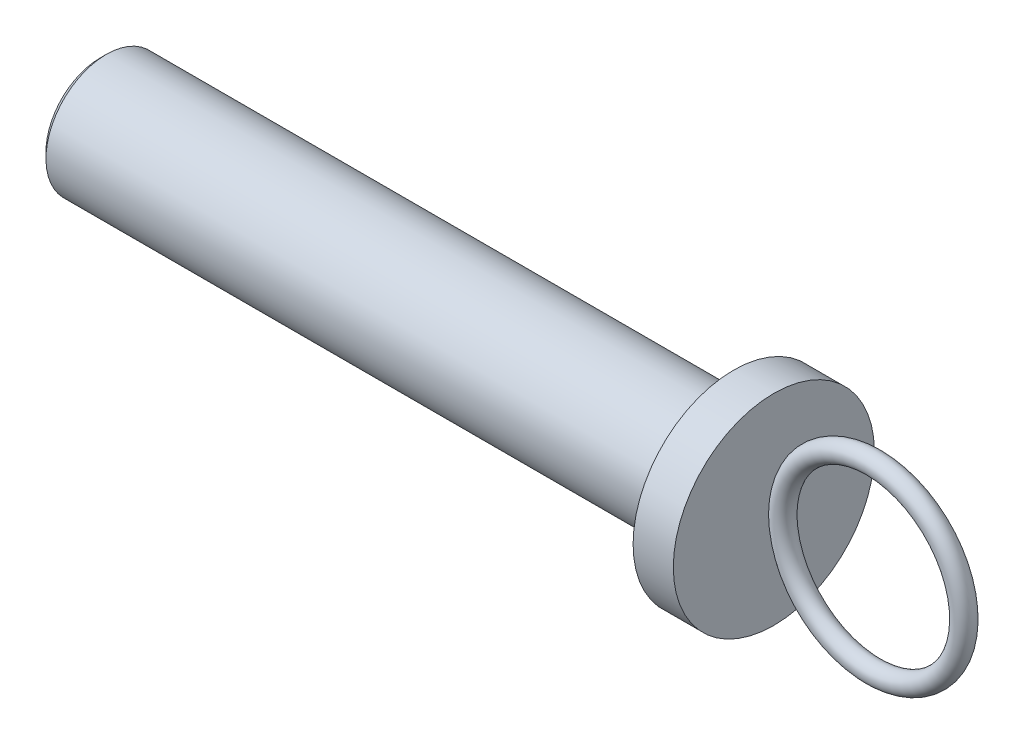
ISO-10303-21;
HEADER;
FILE_DESCRIPTION(('STEP AP214'),'2;1');
FILE_NAME('part.step','',(''),(''),'','','');
FILE_SCHEMA(('AUTOMOTIVE_DESIGN { 1 0 10303 214 1 1 1 1 }'));
ENDSEC;
DATA;
#1=APPLICATION_CONTEXT('core data for automotive mechanical design processes');
#2=APPLICATION_PROTOCOL_DEFINITION('international standard','automotive_design',2000,#1);
#3=PRODUCT_CONTEXT('',#1,'mechanical');
#4=PRODUCT('Part','Part','',(#3));
#5=PRODUCT_RELATED_PRODUCT_CATEGORY('part','',(#4));
#6=PRODUCT_DEFINITION_FORMATION('','',#4);
#7=PRODUCT_DEFINITION_CONTEXT('part definition',#1,'design');
#8=PRODUCT_DEFINITION('design','',#6,#7);
#9=PRODUCT_DEFINITION_SHAPE('','',#8);
#10=(LENGTH_UNIT() NAMED_UNIT(*) SI_UNIT(.MILLI.,.METRE.));
#11=(NAMED_UNIT(*) PLANE_ANGLE_UNIT() SI_UNIT($,.RADIAN.));
#12=(NAMED_UNIT(*) SI_UNIT($,.STERADIAN.) SOLID_ANGLE_UNIT());
#13=UNCERTAINTY_MEASURE_WITH_UNIT(LENGTH_MEASURE(1.E-05),#10,'distance_accuracy_value','');
#14=(GEOMETRIC_REPRESENTATION_CONTEXT(3) GLOBAL_UNCERTAINTY_ASSIGNED_CONTEXT((#13)) GLOBAL_UNIT_ASSIGNED_CONTEXT((#10,
#11,#12)) REPRESENTATION_CONTEXT('',''));
#15=CARTESIAN_POINT('',(0.,0.,0.));
#16=DIRECTION('',(0.,0.,1.));
#17=DIRECTION('',(1.,0.,0.));
#18=AXIS2_PLACEMENT_3D('',#15,#16,#17);
#19=CARTESIAN_POINT('',(0.,0.,0.));
#20=DIRECTION('',(1.,0.,0.));
#21=DIRECTION('',(0.,1.,0.));
#22=AXIS2_PLACEMENT_3D('',#19,#20,#21);
#23=PLANE('',#22);
#24=CARTESIAN_POINT('',(0.,0.,0.));
#25=DIRECTION('',(1.,0.,0.));
#26=DIRECTION('',(0.,1.,0.));
#27=AXIS2_PLACEMENT_3D('',#24,#25,#26);
#28=CIRCLE('',#27,50.);
#29=CARTESIAN_POINT('',(0.,50.,0.));
#30=VERTEX_POINT('',#29);
#31=EDGE_CURVE('E10',#30,#30,#28,.T.);
#32=ORIENTED_EDGE('',*,*,#31,.T.);
#33=EDGE_LOOP('',(#32));
#34=FACE_BOUND('',#33,.T.);
#35=CARTESIAN_POINT('',(0.,0.,2.17944947177033));
#36=CARTESIAN_POINT('',(0.,0.42149878183856,2.17945998659477));
#37=CARTESIAN_POINT('',(0.,0.843027722689126,2.16841904708334));
#38=CARTESIAN_POINT('',(0.,1.68536396219885,2.12318815262287));
#39=CARTESIAN_POINT('',(0.,2.10617001058888,2.08897350495459));
#40=CARTESIAN_POINT('',(0.,2.73471753888769,2.01732833882473));
#41=CARTESIAN_POINT('',(0.,2.94363657789298,1.99008700078861));
#42=CARTESIAN_POINT('',(0.,3.36031705389396,1.92791519862246));
#43=CARTESIAN_POINT('',(0.,3.56807865726714,1.89298587047071));
#44=CARTESIAN_POINT('',(0.,3.9815491142398,1.81421682686651));
#45=CARTESIAN_POINT('',(0.,4.18726089346198,1.77039260504047));
#46=CARTESIAN_POINT('',(0.,4.59603124982678,1.67187975849132));
#47=CARTESIAN_POINT('',(0.,4.79909112998843,1.61719670115698));
#48=CARTESIAN_POINT('',(0.,5.11320466515671,1.52074350807588));
#49=CARTESIAN_POINT('',(0.,5.22572640550955,1.48375706519663));
#50=CARTESIAN_POINT('',(0.,5.44895853441453,1.40443549967379));
#51=CARTESIAN_POINT('',(0.,5.55966794843453,1.36209759965095));
#52=CARTESIAN_POINT('',(0.,5.77845963931046,1.27089103021431));
#53=CARTESIAN_POINT('',(0.,5.8865405251225,1.22201898808466));
#54=CARTESIAN_POINT('',(0.,6.09854862533586,1.11606179693367));
#55=CARTESIAN_POINT('',(0.,6.20248043772922,1.05898608133228));
#56=CARTESIAN_POINT('',(0.,6.40481313003735,0.933359937281019));
#57=CARTESIAN_POINT('',(0.,6.50314189395607,0.864691897900993));
#58=CARTESIAN_POINT('',(0.,6.68726313431992,0.712402419432671));
#59=CARTESIAN_POINT('',(0.,6.77314883497989,0.628903871459761));
#60=CARTESIAN_POINT('',(0.,6.8757787162716,0.498268042379382));
#61=CARTESIAN_POINT('',(0.,6.90303278061325,0.45947898442415));
#62=CARTESIAN_POINT('',(0.,6.95214613324469,0.378547324332877));
#63=CARTESIAN_POINT('',(0.,6.97400491584688,0.336404408336449));
#64=CARTESIAN_POINT('',(0.,7.01083808281939,0.24853394838752));
#65=CARTESIAN_POINT('',(0.,7.0257268979002,0.202769523901598));
#66=CARTESIAN_POINT('',(0.,7.04645295226523,0.109246754611275));
#67=CARTESIAN_POINT('',(0.,7.05230659797149,0.061492185979087));
#68=CARTESIAN_POINT('',(0.,7.05406930243933,-0.0292543239346663));
#69=CARTESIAN_POINT('',(0.,7.0509420613236,-0.072229309776161));
#70=CARTESIAN_POINT('',(0.,7.03716162438825,-0.15695895660505));
#71=CARTESIAN_POINT('',(0.,7.02650140314884,-0.198712440508724));
#72=CARTESIAN_POINT('',(0.,6.99535927964785,-0.289871458175785));
#73=CARTESIAN_POINT('',(0.,6.97311887355608,-0.338667362862952));
#74=CARTESIAN_POINT('',(0.,6.92117709628851,-0.432083951970965));
#75=CARTESIAN_POINT('',(0.,6.89146055486769,-0.476695890687562));
#76=CARTESIAN_POINT('',(0.,6.80485532696441,-0.590572331510381));
#77=CARTESIAN_POINT('',(0.,6.74316841758978,-0.656141724988561));
#78=CARTESIAN_POINT('',(0.,6.61121393622031,-0.777885124418113));
#79=CARTESIAN_POINT('',(0.,6.54092138014418,-0.834030595690454));
#80=CARTESIAN_POINT('',(0.,6.36868536131937,-0.957917873318232));
#81=CARTESIAN_POINT('',(0.,6.26449637346105,-1.02249899099252));
#82=CARTESIAN_POINT('',(0.,6.0504723175763,-1.14166535105351));
#83=CARTESIAN_POINT('',(0.,5.94062622347301,-1.1962300476875));
#84=CARTESIAN_POINT('',(0.,5.71691063613275,-1.29782453209946));
#85=CARTESIAN_POINT('',(0.,5.60302446944741,-1.34481718787084));
#86=CARTESIAN_POINT('',(0.,5.37300224226769,-1.43248201978746));
#87=CARTESIAN_POINT('',(0.,5.25686835672187,-1.47315999292818));
#88=CARTESIAN_POINT('',(0.,4.95344797587697,-1.57200493234357));
#89=CARTESIAN_POINT('',(0.,4.76487364590706,-1.62620743035004));
#90=CARTESIAN_POINT('',(0.,4.38507011567415,-1.72448075127132));
#91=CARTESIAN_POINT('',(0.,4.19383962017605,-1.76854643305016));
#92=CARTESIAN_POINT('',(0.,3.80930747760474,-1.84841620213058));
#93=CARTESIAN_POINT('',(0.,3.61600265523733,-1.88420486609413));
#94=CARTESIAN_POINT('',(0.,3.22819781392611,-1.94865007485328));
#95=CARTESIAN_POINT('',(0.,3.03369761839277,-1.97730553860021));
#96=CARTESIAN_POINT('',(0.,2.44780338105798,-2.05406713367449));
#97=CARTESIAN_POINT('',(0.,2.05515848590833,-2.09274358527696));
#98=CARTESIAN_POINT('',(0.,1.26892169615385,-2.14903314060557));
#99=CARTESIAN_POINT('',(0.,0.875331464804734,-2.16667103490342));
#100=CARTESIAN_POINT('',(0.,0.0355100722776041,-2.18359538728171));
#101=CARTESIAN_POINT('',(0.,-0.410777411562641,-2.18013678180801));
#102=CARTESIAN_POINT('',(0.,-1.30304763369249,-2.14800165032402));
#103=CARTESIAN_POINT('',(0.,-1.74902937985356,-2.11929516613826));
#104=CARTESIAN_POINT('',(0.,-2.41467249606519,-2.05469940727802));
#105=CARTESIAN_POINT('',(0.,-2.63541038360809,-2.02967394396318));
#106=CARTESIAN_POINT('',(0.,-3.07581583397932,-1.97158676878631));
#107=CARTESIAN_POINT('',(0.,-3.29548354427478,-1.93852619803324));
#108=CARTESIAN_POINT('',(0.,-3.73286882380672,-1.86316489118027));
#109=CARTESIAN_POINT('',(0.,-3.95058901460545,-1.82087950567084));
#110=CARTESIAN_POINT('',(0.,-4.38352365652223,-1.72513406489578));
#111=CARTESIAN_POINT('',(0.,-4.5987392380628,-1.6716792750586));
#112=CARTESIAN_POINT('',(0.,-4.93242244589615,-1.57680841630995));
#113=CARTESIAN_POINT('',(0.,-5.05227430378716,-1.54026170895099));
#114=CARTESIAN_POINT('',(0.,-5.29025594647154,-1.46169632013567));
#115=CARTESIAN_POINT('',(0.,-5.40838489898437,-1.4196750855039));
#116=CARTESIAN_POINT('',(0.,-5.6422119188477,-1.32894553586474));
#117=CARTESIAN_POINT('',(0.,-5.75790737835958,-1.28023043032896));
#118=CARTESIAN_POINT('',(0.,-5.98535646460333,-1.17442480556571));
#119=CARTESIAN_POINT('',(0.,-6.09711402125455,-1.11734294769992));
#120=CARTESIAN_POINT('',(0.,-6.31534981053315,-0.991578699532659));
#121=CARTESIAN_POINT('',(0.,-6.42176976259173,-0.922794054102972));
#122=CARTESIAN_POINT('',(0.,-6.62277815714594,-0.769906612766153));
#123=CARTESIAN_POINT('',(0.,-6.71744707452865,-0.685918949242545));
#124=CARTESIAN_POINT('',(0.,-6.83259199612223,-0.554244909761135));
#125=CARTESIAN_POINT('',(0.,-6.86319645284333,-0.515510667955197));
#126=CARTESIAN_POINT('',(0.,-6.91932485823459,-0.434421020387249));
#127=CARTESIAN_POINT('',(0.,-6.94484634796394,-0.392063876101051));
#128=CARTESIAN_POINT('',(0.,-6.98928518334076,-0.303256767548711));
#129=CARTESIAN_POINT('',(0.,-7.00811546072234,-0.25676204012301));
#130=CARTESIAN_POINT('',(0.,-7.03658525286622,-0.161053281266286));
#131=CARTESIAN_POINT('',(0.,-7.04624588755985,-0.111845776224539));
#132=CARTESIAN_POINT('',(0.,-7.05458669702452,-0.01728240125677));
#133=CARTESIAN_POINT('',(0.,-7.05423613779896,0.02798715789848));
#134=CARTESIAN_POINT('',(0.,-7.04497970483613,0.117650334713045));
#135=CARTESIAN_POINT('',(0.,-7.03606695035198,0.162043218575106));
#136=CARTESIAN_POINT('',(0.,-7.00913534044537,0.254122307034996));
#137=CARTESIAN_POINT('',(0.,-6.99009808678667,0.301504089437999));
#138=CARTESIAN_POINT('',(0.,-6.94465769341792,0.392567053069191));
#139=CARTESIAN_POINT('',(0.,-6.91824161676512,0.436241557537717));
#140=CARTESIAN_POINT('',(0.,-6.84211815750932,0.545524279312061));
#141=CARTESIAN_POINT('',(0.,-6.7880843221241,0.608080577602883));
#142=CARTESIAN_POINT('',(0.,-6.67163798663171,0.724744813787047));
#143=CARTESIAN_POINT('',(0.,-6.60920237227783,0.778828521263772));
#144=CARTESIAN_POINT('',(0.,-6.45970866169796,0.89530045457902));
#145=CARTESIAN_POINT('',(0.,-6.37085872507568,0.955358435834267));
#146=CARTESIAN_POINT('',(0.,-6.18785193917911,1.06688305517149));
#147=CARTESIAN_POINT('',(0.,-6.09368529018751,1.11833308662321));
#148=CARTESIAN_POINT('',(0.,-5.90148662885084,1.21470068123799));
#149=CARTESIAN_POINT('',(0.,-5.80343695173868,1.25958261175952));
#150=CARTESIAN_POINT('',(0.,-5.60510795366906,1.34378051469834));
#151=CARTESIAN_POINT('',(0.,-5.50483061170207,1.38310121541691));
#152=CARTESIAN_POINT('',(0.,-5.24427436420939,1.47856605905192));
#153=CARTESIAN_POINT('',(0.,-5.0827593113308,1.5313265727075));
#154=CARTESIAN_POINT('',(0.,-4.75708536476196,1.62804561156496));
#155=CARTESIAN_POINT('',(0.,-4.59292514748774,1.67199957243182));
#156=CARTESIAN_POINT('',(0.,-4.26255226726789,1.75275184318911));
#157=CARTESIAN_POINT('',(0.,-4.09633641566277,1.78953699942011));
#158=CARTESIAN_POINT('',(0.,-3.76265354985,1.85695917294306));
#159=CARTESIAN_POINT('',(0.,-3.59518634810483,1.88759524870568));
#160=CARTESIAN_POINT('',(0.,-3.09173815919111,1.97146155174675));
#161=CARTESIAN_POINT('',(0.,-2.75442000828965,2.01671741415881));
#162=CARTESIAN_POINT('',(0.,-2.07833897486486,2.08987891962339));
#163=CARTESIAN_POINT('',(0.,-1.73957793284239,2.11780234154776));
#164=CARTESIAN_POINT('',(0.,-1.167276062117,2.15200686118283));
#165=CARTESIAN_POINT('',(0.,-0.933967456387854,2.16232552057151));
#166=CARTESIAN_POINT('',(0.,-0.467109010978816,2.17604453260486));
#167=CARTESIAN_POINT('',(0.,-0.233559135566106,2.17944364533994));
#168=CARTESIAN_POINT('',(0.,0.,2.17944947177033));
#169=B_SPLINE_CURVE_WITH_KNOTS('',3,(#35,#36,#37,#38,#39,#40,#41,#42,#43,#44,#45,#46,#47,#48,
#49,#50,#51,#52,#53,#54,#55,#56,#57,#58,#59,#60,#61,#62,#63,#64,#65,#66,#67,#68,#69,#70,#71,#72,
#73,#74,#75,#76,#77,#78,#79,#80,#81,#82,#83,#84,#85,#86,#87,#88,#89,#90,#91,#92,#93,#94,#95,#96,
#97,#98,#99,#100,#101,#102,#103,#104,#105,#106,#107,#108,#109,#110,#111,#112,#113,#114,#115,
#116,#117,#118,#119,#120,#121,#122,#123,#124,#125,#126,#127,#128,#129,#130,#131,#132,#133,#134,
#135,#136,#137,#138,#139,#140,#141,#142,#143,#144,#145,#146,#147,#148,#149,#150,#151,#152,#153,
#154,#155,#156,#157,#158,#159,#160,#161,#162,#163,#164,#165,#166,#167,#168),.UNSPECIFIED.,.T.,
.F.,(4,2,2,2,2,2,2,2,2,2,2,2,2,2,2,2,2,2,2,2,2,2,2,2,2,2,2,2,2,2,2,2,2,2,2,2,2,2,2,2,2,2,2,2,2,
2,2,2,2,2,2,2,2,2,2,2,2,2,2,2,2,2,2,2,2,2,4),(0.,1.26441863343538,2.5301866907775,
3.16213858340576,3.79399716136293,4.42476443491072,5.05520914148919,5.41044125196759,
5.76585848899681,6.12145989448238,6.47665561688514,6.83569929330721,7.19189592183801,
7.33378713970543,7.47569165167126,7.61929535633629,7.76263799159498,7.89119158031978,
8.01986521939751,8.1798429188074,8.3401478937655,8.60870050608162,8.8780521467,9.24491867464901,
9.61252951225128,9.98189152543646,10.3509124262644,10.939135055324,11.5276553614474,
12.1172636319069,12.7069612041785,13.8898434457294,15.071330468632,16.4095616881391,
17.749382947544,18.4157249508587,19.0819723785898,19.7471194782951,20.4119537220435,
20.787754445286,21.163731063733,21.5400919429709,21.9160659252196,22.2955117580467,
22.6721959047942,22.8199929083666,22.9678612376089,23.1175887136578,23.2669704878172,
23.4019432479989,23.537024565733,23.6893734133344,23.8419910618698,24.0885758346499,
24.3358534146157,24.6568418383956,24.9784425519177,25.3017279899105,25.6247368882881,
26.1341191362447,26.6437647120882,27.1543367826725,27.6649869710313,28.685394150744,
29.7047529034348,30.4052617359112,31.1058960811179),.UNSPECIFIED.);
#170=CARTESIAN_POINT('',(0.,0.,2.17944947177033));
#171=VERTEX_POINT('',#170);
#172=EDGE_CURVE('E36',#171,#171,#169,.T.);
#173=ORIENTED_EDGE('',*,*,#172,.T.);
#174=EDGE_LOOP('',(#173));
#175=FACE_BOUND('',#174,.T.);
#176=ADVANCED_FACE('F32',(#34,#175),#23,.T.);
#177=CARTESIAN_POINT('',(0.,0.,0.));
#178=DIRECTION('',(1.,0.,0.));
#179=DIRECTION('',(0.,1.,0.));
#180=AXIS2_PLACEMENT_3D('',#177,#178,#179);
#181=CYLINDRICAL_SURFACE('',#180,50.);
#182=CARTESIAN_POINT('',(-20.,0.,0.));
#183=DIRECTION('',(1.,0.,0.));
#184=DIRECTION('',(0.,1.,0.));
#185=AXIS2_PLACEMENT_3D('',#182,#183,#184);
#186=CIRCLE('',#185,50.);
#187=CARTESIAN_POINT('',(-20.,50.,0.));
#188=VERTEX_POINT('',#187);
#189=EDGE_CURVE('E43',#188,#188,#186,.T.);
#190=ORIENTED_EDGE('',*,*,#189,.T.);
#191=EDGE_LOOP('',(#190));
#192=FACE_BOUND('',#191,.T.);
#193=ORIENTED_EDGE('',*,*,#31,.F.);
#194=EDGE_LOOP('',(#193));
#195=FACE_BOUND('',#194,.T.);
#196=ADVANCED_FACE('F74',(#192,#195),#181,.T.);
#197=CARTESIAN_POINT('',(-20.,50.,0.));
#198=DIRECTION('',(-1.,0.,0.));
#199=DIRECTION('',(0.,-1.,0.));
#200=AXIS2_PLACEMENT_3D('',#197,#198,#199);
#201=PLANE('',#200);
#202=CARTESIAN_POINT('',(-20.,0.,0.));
#203=DIRECTION('',(1.,0.,0.));
#204=DIRECTION('',(0.,1.,0.));
#205=AXIS2_PLACEMENT_3D('',#202,#203,#204);
#206=CIRCLE('',#205,30.);
#207=CARTESIAN_POINT('',(-20.,30.,0.));
#208=VERTEX_POINT('',#207);
#209=EDGE_CURVE('E47',#208,#208,#206,.T.);
#210=ORIENTED_EDGE('',*,*,#209,.T.);
#211=EDGE_LOOP('',(#210));
#212=FACE_BOUND('',#211,.T.);
#213=ORIENTED_EDGE('',*,*,#189,.F.);
#214=EDGE_LOOP('',(#213));
#215=FACE_BOUND('',#214,.T.);
#216=ADVANCED_FACE('F78',(#212,#215),#201,.T.);
#217=CARTESIAN_POINT('',(0.,0.,0.));
#218=DIRECTION('',(1.,0.,0.));
#219=DIRECTION('',(0.,1.,0.));
#220=AXIS2_PLACEMENT_3D('',#217,#218,#219);
#221=CYLINDRICAL_SURFACE('',#220,30.);
#222=CARTESIAN_POINT('',(-332.,0.,0.));
#223=DIRECTION('',(1.,0.,0.));
#224=DIRECTION('',(0.,1.,0.));
#225=AXIS2_PLACEMENT_3D('',#222,#223,#224);
#226=CIRCLE('',#225,30.);
#227=CARTESIAN_POINT('',(-332.,30.,0.));
#228=VERTEX_POINT('',#227);
#229=EDGE_CURVE('E52',#228,#228,#226,.T.);
#230=ORIENTED_EDGE('',*,*,#229,.T.);
#231=EDGE_LOOP('',(#230));
#232=FACE_BOUND('',#231,.T.);
#233=ORIENTED_EDGE('',*,*,#209,.F.);
#234=EDGE_LOOP('',(#233));
#235=FACE_BOUND('',#234,.T.);
#236=ADVANCED_FACE('F83',(#232,#235),#221,.T.);
#237=CARTESIAN_POINT('',(-332.,0.,0.));
#238=DIRECTION('',(1.,0.,0.));
#239=DIRECTION('',(0.,1.,0.));
#240=AXIS2_PLACEMENT_3D('',#237,#238,#239);
#241=CONICAL_SURFACE('',#240,30.,0.785398163397448);
#242=CARTESIAN_POINT('',(-335.,0.,0.));
#243=DIRECTION('',(1.,0.,0.));
#244=DIRECTION('',(0.,1.,0.));
#245=AXIS2_PLACEMENT_3D('',#242,#243,#244);
#246=CIRCLE('',#245,27.);
#247=CARTESIAN_POINT('',(-335.,27.,0.));
#248=VERTEX_POINT('',#247);
#249=EDGE_CURVE('E55',#248,#248,#246,.T.);
#250=ORIENTED_EDGE('',*,*,#249,.T.);
#251=EDGE_LOOP('',(#250));
#252=FACE_BOUND('',#251,.T.);
#253=ORIENTED_EDGE('',*,*,#229,.F.);
#254=EDGE_LOOP('',(#253));
#255=FACE_BOUND('',#254,.T.);
#256=ADVANCED_FACE('F69',(#252,#255),#241,.T.);
#257=CARTESIAN_POINT('',(-335.,27.,0.));
#258=DIRECTION('',(-1.,0.,0.));
#259=DIRECTION('',(0.,-1.,0.));
#260=AXIS2_PLACEMENT_3D('',#257,#258,#259);
#261=PLANE('',#260);
#262=ORIENTED_EDGE('',*,*,#249,.F.);
#263=EDGE_LOOP('',(#262));
#264=FACE_BOUND('',#263,.T.);
#265=ADVANCED_FACE('F65',(#264),#261,.T.);
#266=CARTESIAN_POINT('',(49.5,0.,0.));
#267=DIRECTION('',(0.,0.,1.));
#268=DIRECTION('',(1.,0.,0.));
#269=AXIS2_PLACEMENT_3D('',#266,#267,#268);
#270=TOROIDAL_SURFACE('',#269,45.,5.);
#271=ORIENTED_EDGE('',*,*,#172,.F.);
#272=EDGE_LOOP('',(#271));
#273=FACE_BOUND('',#272,.T.);
#274=ADVANCED_FACE('F63',(#273),#270,.T.);
#275=CLOSED_SHELL('',(#176,#196,#216,#236,#256,#265,#274));
#276=MANIFOLD_SOLID_BREP('B2',#275);
#277=ADVANCED_BREP_SHAPE_REPRESENTATION('',(#18,#276),#14);
#278=SHAPE_DEFINITION_REPRESENTATION(#9,#277);
ENDSEC;
END-ISO-10303-21;
